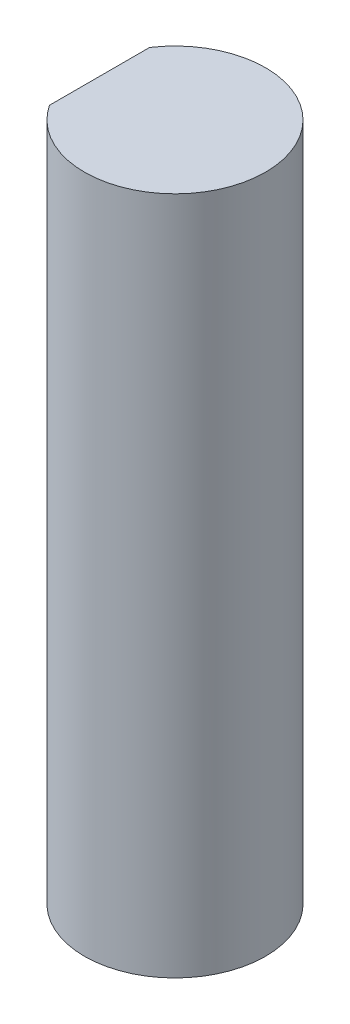
ISO-10303-21;
HEADER;
FILE_DESCRIPTION(('STEP AP214'),'2;1');
FILE_NAME('part.step','',(''),(''),'','','');
FILE_SCHEMA(('AUTOMOTIVE_DESIGN { 1 0 10303 214 1 1 1 1 }'));
ENDSEC;
DATA;
#1=APPLICATION_CONTEXT('core data for automotive mechanical design processes');
#2=APPLICATION_PROTOCOL_DEFINITION('international standard','automotive_design',2000,#1);
#3=PRODUCT_CONTEXT('',#1,'mechanical');
#4=PRODUCT('Part','Part','',(#3));
#5=PRODUCT_RELATED_PRODUCT_CATEGORY('part','',(#4));
#6=PRODUCT_DEFINITION_FORMATION('','',#4);
#7=PRODUCT_DEFINITION_CONTEXT('part definition',#1,'design');
#8=PRODUCT_DEFINITION('design','',#6,#7);
#9=PRODUCT_DEFINITION_SHAPE('','',#8);
#10=(LENGTH_UNIT() NAMED_UNIT(*) SI_UNIT(.MILLI.,.METRE.));
#11=(NAMED_UNIT(*) PLANE_ANGLE_UNIT() SI_UNIT($,.RADIAN.));
#12=(NAMED_UNIT(*) SI_UNIT($,.STERADIAN.) SOLID_ANGLE_UNIT());
#13=UNCERTAINTY_MEASURE_WITH_UNIT(LENGTH_MEASURE(1.E-05),#10,'distance_accuracy_value','');
#14=(GEOMETRIC_REPRESENTATION_CONTEXT(3) GLOBAL_UNCERTAINTY_ASSIGNED_CONTEXT((#13)) GLOBAL_UNIT_ASSIGNED_CONTEXT((#10,
#11,#12)) REPRESENTATION_CONTEXT('',''));
#15=CARTESIAN_POINT('',(0.,0.,0.));
#16=DIRECTION('',(0.,0.,1.));
#17=DIRECTION('',(1.,0.,0.));
#18=AXIS2_PLACEMENT_3D('',#15,#16,#17);
#19=CARTESIAN_POINT('',(0.,22.5,0.));
#20=DIRECTION('',(0.,-1.,0.));
#21=DIRECTION('',(0.,0.,-1.));
#22=AXIS2_PLACEMENT_3D('',#19,#20,#21);
#23=CYLINDRICAL_SURFACE('',#22,3.);
#24=CARTESIAN_POINT('',(0.,22.5,0.));
#25=DIRECTION('',(0.,1.,0.));
#26=DIRECTION('',(0.,0.,1.));
#27=AXIS2_PLACEMENT_3D('',#24,#25,#26);
#28=CIRCLE('',#27,3.);
#29=CARTESIAN_POINT('',(-2.5,22.5,1.6583123951777));
#30=VERTEX_POINT('',#29);
#31=CARTESIAN_POINT('',(-2.5,22.5,-1.6583123951777));
#32=VERTEX_POINT('',#31);
#33=EDGE_CURVE('E11',#30,#32,#28,.T.);
#34=ORIENTED_EDGE('',*,*,#33,.F.);
#35=DIRECTION('',(0.,1.,0.));
#36=VECTOR('',#35,1.);
#37=CARTESIAN_POINT('',(-2.5,12.5,1.6583123951777));
#38=LINE('',#37,#36);
#39=CARTESIAN_POINT('',(-2.5,12.5,1.6583123951777));
#40=VERTEX_POINT('',#39);
#41=EDGE_CURVE('E50',#40,#30,#38,.T.);
#42=ORIENTED_EDGE('',*,*,#41,.F.);
#43=CARTESIAN_POINT('',(0.,12.5,0.));
#44=DIRECTION('',(0.,1.,0.));
#45=DIRECTION('',(0.,0.,1.));
#46=AXIS2_PLACEMENT_3D('',#43,#44,#45);
#47=CIRCLE('',#46,3.);
#48=CARTESIAN_POINT('',(-2.5,12.5,-1.6583123951777));
#49=VERTEX_POINT('',#48);
#50=EDGE_CURVE('E65',#49,#40,#47,.T.);
#51=ORIENTED_EDGE('',*,*,#50,.F.);
#52=DIRECTION('',(0.,1.,0.));
#53=VECTOR('',#52,1.);
#54=CARTESIAN_POINT('',(-2.5,12.5,-1.6583123951777));
#55=LINE('',#54,#53);
#56=EDGE_CURVE('E56',#49,#32,#55,.T.);
#57=ORIENTED_EDGE('',*,*,#56,.T.);
#58=EDGE_LOOP('',(#34,#42,#51,#57));
#59=FACE_BOUND('',#58,.T.);
#60=CARTESIAN_POINT('',(0.,0.,0.));
#61=DIRECTION('',(0.,1.,0.));
#62=DIRECTION('',(0.,0.,1.));
#63=AXIS2_PLACEMENT_3D('',#60,#61,#62);
#64=CIRCLE('',#63,3.);
#65=CARTESIAN_POINT('',(0.,0.,3.));
#66=VERTEX_POINT('',#65);
#67=EDGE_CURVE('E39',#66,#66,#64,.T.);
#68=ORIENTED_EDGE('',*,*,#67,.T.);
#69=EDGE_LOOP('',(#68));
#70=FACE_BOUND('',#69,.T.);
#71=ADVANCED_FACE('F36',(#59,#70),#23,.T.);
#72=CARTESIAN_POINT('',(0.,22.5,0.));
#73=DIRECTION('',(0.,1.,0.));
#74=DIRECTION('',(0.,0.,1.));
#75=AXIS2_PLACEMENT_3D('',#72,#73,#74);
#76=PLANE('',#75);
#77=DIRECTION('',(0.,0.,-1.));
#78=VECTOR('',#77,1.);
#79=CARTESIAN_POINT('',(-2.5,22.5,1.6583123951777));
#80=LINE('',#79,#78);
#81=EDGE_CURVE('E61',#30,#32,#80,.T.);
#82=ORIENTED_EDGE('',*,*,#81,.F.);
#83=ORIENTED_EDGE('',*,*,#33,.T.);
#84=EDGE_LOOP('',(#82,#83));
#85=FACE_BOUND('',#84,.T.);
#86=ADVANCED_FACE('F71',(#85),#76,.T.);
#87=CARTESIAN_POINT('',(0.,0.,0.));
#88=DIRECTION('',(0.,1.,0.));
#89=DIRECTION('',(0.,0.,1.));
#90=AXIS2_PLACEMENT_3D('',#87,#88,#89);
#91=PLANE('',#90);
#92=ORIENTED_EDGE('',*,*,#67,.F.);
#93=EDGE_LOOP('',(#92));
#94=FACE_BOUND('',#93,.T.);
#95=ADVANCED_FACE('F73',(#94),#91,.F.);
#96=CARTESIAN_POINT('',(-2.5,12.5,1.6583123951777));
#97=DIRECTION('',(1.,0.,0.));
#98=DIRECTION('',(0.,0.,-1.));
#99=AXIS2_PLACEMENT_3D('',#96,#97,#98);
#100=PLANE('',#99);
#101=ORIENTED_EDGE('',*,*,#81,.T.);
#102=ORIENTED_EDGE('',*,*,#56,.F.);
#103=DIRECTION('',(0.,0.,-1.));
#104=VECTOR('',#103,1.);
#105=CARTESIAN_POINT('',(-2.5,12.5,1.6583123951777));
#106=LINE('',#105,#104);
#107=EDGE_CURVE('E88',#40,#49,#106,.T.);
#108=ORIENTED_EDGE('',*,*,#107,.F.);
#109=ORIENTED_EDGE('',*,*,#41,.T.);
#110=EDGE_LOOP('',(#101,#102,#108,#109));
#111=FACE_BOUND('',#110,.T.);
#112=ADVANCED_FACE('F62',(#111),#100,.F.);
#113=CARTESIAN_POINT('',(0.,12.5,0.));
#114=DIRECTION('',(0.,1.,0.));
#115=DIRECTION('',(0.,0.,1.));
#116=AXIS2_PLACEMENT_3D('',#113,#114,#115);
#117=PLANE('',#116);
#118=ORIENTED_EDGE('',*,*,#50,.T.);
#119=ORIENTED_EDGE('',*,*,#107,.T.);
#120=EDGE_LOOP('',(#118,#119));
#121=FACE_BOUND('',#120,.T.);
#122=ADVANCED_FACE('F83',(#121),#117,.T.);
#123=CLOSED_SHELL('',(#71,#86,#95,#112,#122));
#124=MANIFOLD_SOLID_BREP('B2',#123);
#125=ADVANCED_BREP_SHAPE_REPRESENTATION('',(#18,#124),#14);
#126=SHAPE_DEFINITION_REPRESENTATION(#9,#125);
ENDSEC;
END-ISO-10303-21;
